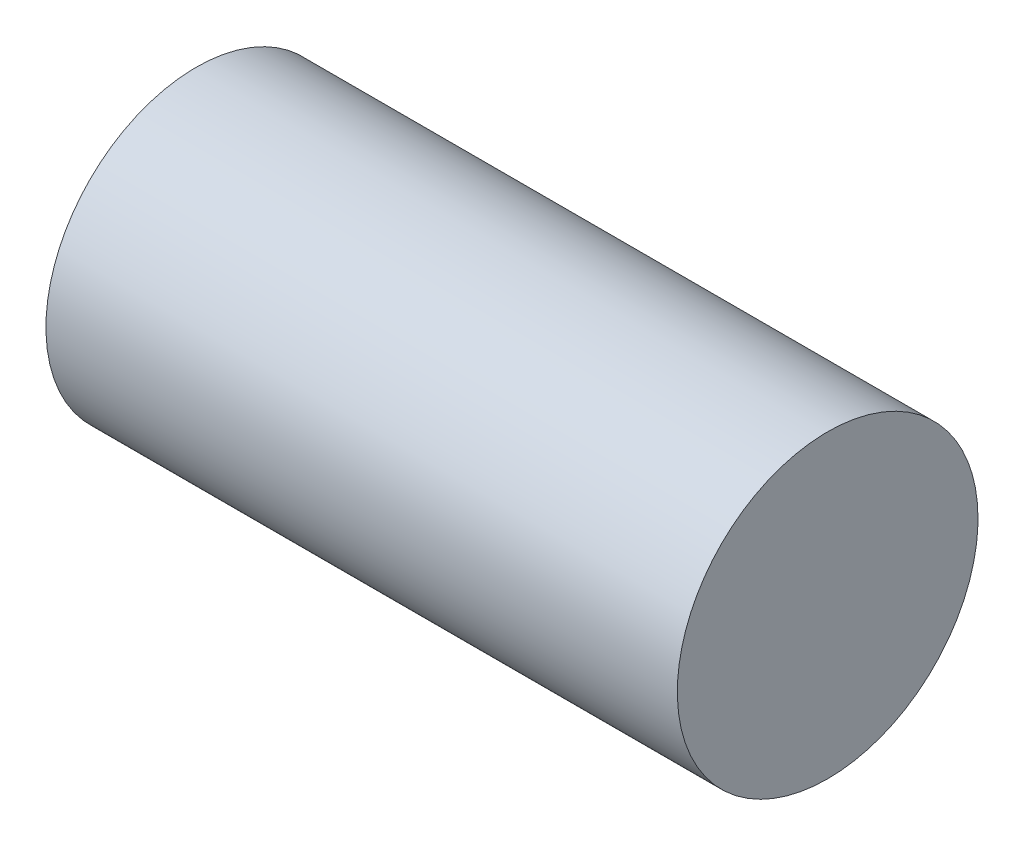
ISO-10303-21;
HEADER;
FILE_DESCRIPTION(('STEP AP214'),'2;1');
FILE_NAME('part.step','',(''),(''),'','','');
FILE_SCHEMA(('AUTOMOTIVE_DESIGN { 1 0 10303 214 1 1 1 1 }'));
ENDSEC;
DATA;
#1=APPLICATION_CONTEXT('core data for automotive mechanical design processes');
#2=APPLICATION_PROTOCOL_DEFINITION('international standard','automotive_design',2000,#1);
#3=PRODUCT_CONTEXT('',#1,'mechanical');
#4=PRODUCT('Part','Part','',(#3));
#5=PRODUCT_RELATED_PRODUCT_CATEGORY('part','',(#4));
#6=PRODUCT_DEFINITION_FORMATION('','',#4);
#7=PRODUCT_DEFINITION_CONTEXT('part definition',#1,'design');
#8=PRODUCT_DEFINITION('design','',#6,#7);
#9=PRODUCT_DEFINITION_SHAPE('','',#8);
#10=(LENGTH_UNIT() NAMED_UNIT(*) SI_UNIT(.MILLI.,.METRE.));
#11=(NAMED_UNIT(*) PLANE_ANGLE_UNIT() SI_UNIT($,.RADIAN.));
#12=(NAMED_UNIT(*) SI_UNIT($,.STERADIAN.) SOLID_ANGLE_UNIT());
#13=UNCERTAINTY_MEASURE_WITH_UNIT(LENGTH_MEASURE(1.E-05),#10,'distance_accuracy_value','');
#14=(GEOMETRIC_REPRESENTATION_CONTEXT(3) GLOBAL_UNCERTAINTY_ASSIGNED_CONTEXT((#13)) GLOBAL_UNIT_ASSIGNED_CONTEXT((#10,
#11,#12)) REPRESENTATION_CONTEXT('',''));
#15=CARTESIAN_POINT('',(0.,0.,0.));
#16=DIRECTION('',(0.,0.,1.));
#17=DIRECTION('',(1.,0.,0.));
#18=AXIS2_PLACEMENT_3D('',#15,#16,#17);
#19=CARTESIAN_POINT('',(2.25,-0.125,0.25));
#20=CARTESIAN_POINT('',(2.25,0.125,0.25));
#21=CARTESIAN_POINT('',(2.25,-0.125,0.));
#22=CARTESIAN_POINT('',(2.25,0.125,0.));
#23=(BOUNDED_SURFACE() B_SPLINE_SURFACE(1,1,((#19,#20),(#21,#22)),.UNSPECIFIED.,.F.,.F.,
.F.) B_SPLINE_SURFACE_WITH_KNOTS((2,2),(2,2),(-0.125,0.125),(-0.125,0.125),
.UNSPECIFIED.) GEOMETRIC_REPRESENTATION_ITEM() RATIONAL_B_SPLINE_SURFACE(((1.,1.),(1.,1.))) REPRESENTATION_ITEM('') SURFACE());
#24=CARTESIAN_POINT('',(2.25,0.,0.));
#25=CARTESIAN_POINT('',(2.25,0.216506350946,0.));
#26=CARTESIAN_POINT('',(2.25,0.108253175473,0.1875));
#27=CARTESIAN_POINT('',(2.25,0.,0.375));
#28=CARTESIAN_POINT('',(2.25,-0.108253175473,0.1875));
#29=CARTESIAN_POINT('',(2.25,-0.216506350946,0.));
#30=CARTESIAN_POINT('',(2.25,0.,0.));
#31=(BOUNDED_CURVE() B_SPLINE_CURVE(2,(#24,#25,#26,#27,#28,#29,#30),.UNSPECIFIED.,.T.,
.F.) B_SPLINE_CURVE_WITH_KNOTS((3,2,2,3),(0.,2.094395102393,4.188790204786,6.28318530718),
.UNSPECIFIED.) CURVE() GEOMETRIC_REPRESENTATION_ITEM() RATIONAL_B_SPLINE_CURVE((1.,0.5,1.,0.5,
1.,0.5,1.)) REPRESENTATION_ITEM(''));
#32=CARTESIAN_POINT('',(2.25,0.,0.));
#33=VERTEX_POINT('',#32);
#34=EDGE_CURVE('E11',#33,#33,#31,.T.);
#35=ORIENTED_EDGE('',*,*,#34,.T.);
#36=EDGE_LOOP('',(#35));
#37=FACE_BOUND('',#36,.T.);
#38=ADVANCED_FACE('F17',(#37),#23,.T.);
#39=CARTESIAN_POINT('',(1.725,-0.125,0.25));
#40=CARTESIAN_POINT('',(1.725,0.125,0.25));
#41=CARTESIAN_POINT('',(1.725,-0.125,0.));
#42=CARTESIAN_POINT('',(1.725,0.125,0.));
#43=(BOUNDED_SURFACE() B_SPLINE_SURFACE(1,1,((#39,#40),(#41,#42)),.UNSPECIFIED.,.F.,.F.,
.F.) B_SPLINE_SURFACE_WITH_KNOTS((2,2),(2,2),(-0.125,0.125),(-0.125,0.125),
.UNSPECIFIED.) GEOMETRIC_REPRESENTATION_ITEM() RATIONAL_B_SPLINE_SURFACE(((1.,1.),(1.,1.))) REPRESENTATION_ITEM('') SURFACE());
#44=CARTESIAN_POINT('',(1.725,0.,0.));
#45=CARTESIAN_POINT('',(1.725,0.216506350946,0.));
#46=CARTESIAN_POINT('',(1.725,0.108253175473,0.1875));
#47=CARTESIAN_POINT('',(1.725,0.,0.375));
#48=CARTESIAN_POINT('',(1.725,-0.108253175473,0.1875));
#49=CARTESIAN_POINT('',(1.725,-0.216506350946,0.));
#50=CARTESIAN_POINT('',(1.725,0.,0.));
#51=(BOUNDED_CURVE() B_SPLINE_CURVE(2,(#44,#45,#46,#47,#48,#49,#50),.UNSPECIFIED.,.T.,
.F.) B_SPLINE_CURVE_WITH_KNOTS((3,2,2,3),(0.,2.094395102393,4.188790204786,6.28318530718),
.UNSPECIFIED.) CURVE() GEOMETRIC_REPRESENTATION_ITEM() RATIONAL_B_SPLINE_CURVE((1.,0.5,1.,0.5,
1.,0.5,1.)) REPRESENTATION_ITEM(''));
#52=CARTESIAN_POINT('',(1.725,0.,0.));
#53=VERTEX_POINT('',#52);
#54=EDGE_CURVE('E47',#53,#53,#51,.T.);
#55=ORIENTED_EDGE('',*,*,#54,.F.);
#56=EDGE_LOOP('',(#55));
#57=FACE_BOUND('',#56,.T.);
#58=ADVANCED_FACE('F70',(#57),#43,.F.);
#59=CARTESIAN_POINT('',(1.725,0.,0.));
#60=CARTESIAN_POINT('',(2.25,0.,0.));
#61=CARTESIAN_POINT('',(1.725,0.216506350946,0.));
#62=CARTESIAN_POINT('',(2.25,0.216506350946,0.));
#63=CARTESIAN_POINT('',(1.725,0.108253175473,0.1875));
#64=CARTESIAN_POINT('',(2.25,0.108253175473,0.1875));
#65=CARTESIAN_POINT('',(1.725,0.,0.375));
#66=CARTESIAN_POINT('',(2.25,0.,0.375));
#67=CARTESIAN_POINT('',(1.725,-0.108253175473,0.1875));
#68=CARTESIAN_POINT('',(2.25,-0.108253175473,0.1875));
#69=CARTESIAN_POINT('',(1.725,-0.216506350946,0.));
#70=CARTESIAN_POINT('',(2.25,-0.216506350946,0.));
#71=CARTESIAN_POINT('',(1.725,0.,0.));
#72=CARTESIAN_POINT('',(2.25,0.,0.));
#73=(BOUNDED_SURFACE() B_SPLINE_SURFACE(2,1,((#59,#60),(#61,#62),(#63,#64),(#65,#66),(#67,#68),
(#69,#70),(#71,#72)),.UNSPECIFIED.,.T.,.F.,.F.) B_SPLINE_SURFACE_WITH_KNOTS((3,2,2,3),(2,2),(0.,
2.094395102393,4.188790204786,6.28318530718),(0.,0.525),
.UNSPECIFIED.) GEOMETRIC_REPRESENTATION_ITEM() RATIONAL_B_SPLINE_SURFACE(((1.,1.),(0.5,0.5),(1.,
1.),(0.5,0.5),(1.,1.),(0.5,0.5),(1.,1.))) REPRESENTATION_ITEM('') SURFACE());
#74=CARTESIAN_POINT('',(1.725,0.,0.));
#75=CARTESIAN_POINT('',(2.25,0.,0.));
#76=(BOUNDED_CURVE() B_SPLINE_CURVE(1,(#74,#75),.UNSPECIFIED.,.F.,
.F.) B_SPLINE_CURVE_WITH_KNOTS((2,2),(0.,1.),
.UNSPECIFIED.) CURVE() GEOMETRIC_REPRESENTATION_ITEM() RATIONAL_B_SPLINE_CURVE((1.,1.)) REPRESENTATION_ITEM(''));
#77=EDGE_CURVE('E23',#53,#33,#76,.T.);
#78=ORIENTED_EDGE('',*,*,#54,.T.);
#79=ORIENTED_EDGE('',*,*,#77,.T.);
#80=ORIENTED_EDGE('',*,*,#34,.F.);
#81=ORIENTED_EDGE('',*,*,#77,.F.);
#82=EDGE_LOOP('',(#78,#79,#80,#81));
#83=FACE_BOUND('',#82,.T.);
#84=ADVANCED_FACE('F19',(#83),#73,.T.);
#85=CLOSED_SHELL('',(#38,#58,#84));
#86=MANIFOLD_SOLID_BREP('B1',#85);
#87=ADVANCED_BREP_SHAPE_REPRESENTATION('',(#18,#86),#14);
#88=SHAPE_DEFINITION_REPRESENTATION(#9,#87);
ENDSEC;
END-ISO-10303-21;
